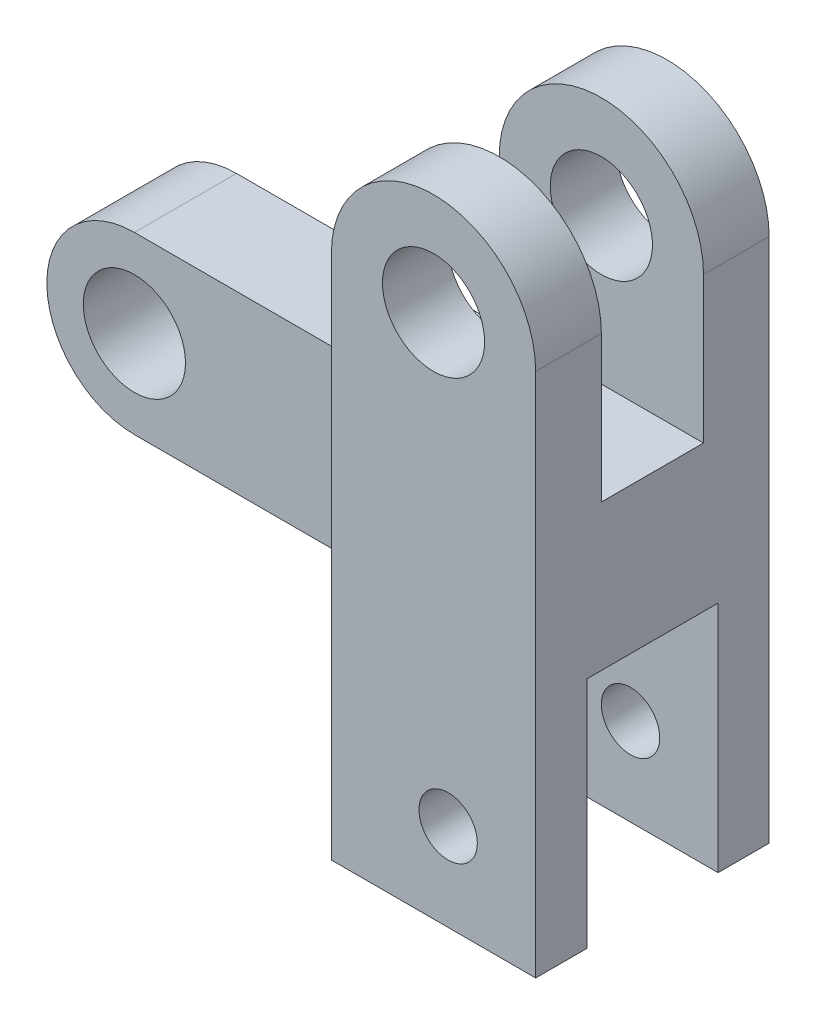
ISO-10303-21;
HEADER;
FILE_DESCRIPTION(('STEP AP214'),'2;1');
FILE_NAME('part.step','',(''),(''),'','','');
FILE_SCHEMA(('AUTOMOTIVE_DESIGN { 1 0 10303 214 1 1 1 1 }'));
ENDSEC;
DATA;
#1=APPLICATION_CONTEXT('core data for automotive mechanical design processes');
#2=APPLICATION_PROTOCOL_DEFINITION('international standard','automotive_design',2000,#1);
#3=PRODUCT_CONTEXT('',#1,'mechanical');
#4=PRODUCT('Part','Part','',(#3));
#5=PRODUCT_RELATED_PRODUCT_CATEGORY('part','',(#4));
#6=PRODUCT_DEFINITION_FORMATION('','',#4);
#7=PRODUCT_DEFINITION_CONTEXT('part definition',#1,'design');
#8=PRODUCT_DEFINITION('design','',#6,#7);
#9=PRODUCT_DEFINITION_SHAPE('','',#8);
#10=(LENGTH_UNIT() NAMED_UNIT(*) SI_UNIT(.MILLI.,.METRE.));
#11=(NAMED_UNIT(*) PLANE_ANGLE_UNIT() SI_UNIT($,.RADIAN.));
#12=(NAMED_UNIT(*) SI_UNIT($,.STERADIAN.) SOLID_ANGLE_UNIT());
#13=UNCERTAINTY_MEASURE_WITH_UNIT(LENGTH_MEASURE(1.E-05),#10,'distance_accuracy_value','');
#14=(GEOMETRIC_REPRESENTATION_CONTEXT(3) GLOBAL_UNCERTAINTY_ASSIGNED_CONTEXT((#13)) GLOBAL_UNIT_ASSIGNED_CONTEXT((#10,
#11,#12)) REPRESENTATION_CONTEXT('',''));
#15=CARTESIAN_POINT('',(0.,0.,0.));
#16=DIRECTION('',(0.,0.,1.));
#17=DIRECTION('',(1.,0.,0.));
#18=AXIS2_PLACEMENT_3D('',#15,#16,#17);
#19=CARTESIAN_POINT('',(0.,2.4,-3.5));
#20=DIRECTION('',(1.,0.,0.));
#21=DIRECTION('',(0.,0.,-1.));
#22=AXIS2_PLACEMENT_3D('',#19,#20,#21);
#23=PLANE('',#22);
#24=DIRECTION('',(0.,-1.,0.));
#25=VECTOR('',#24,1.);
#26=CARTESIAN_POINT('',(0.,0.,2.25));
#27=LINE('',#26,#25);
#28=CARTESIAN_POINT('',(0.,0.,2.25));
#29=VERTEX_POINT('',#28);
#30=CARTESIAN_POINT('',(0.,-8.,2.25));
#31=VERTEX_POINT('',#30);
#32=EDGE_CURVE('E239',#29,#31,#27,.T.);
#33=ORIENTED_EDGE('',*,*,#32,.T.);
#34=DIRECTION('',(0.,0.,-1.));
#35=VECTOR('',#34,1.);
#36=CARTESIAN_POINT('',(0.,-8.,3.5));
#37=LINE('',#36,#35);
#38=CARTESIAN_POINT('',(0.,-8.,4.));
#39=VERTEX_POINT('',#38);
#40=EDGE_CURVE('E278',#39,#31,#37,.T.);
#41=ORIENTED_EDGE('',*,*,#40,.F.);
#42=DIRECTION('',(0.,-1.,0.));
#43=VECTOR('',#42,1.);
#44=CARTESIAN_POINT('',(0.,10.,4.));
#45=LINE('',#44,#43);
#46=CARTESIAN_POINT('',(0.,10.,4.));
#47=VERTEX_POINT('',#46);
#48=EDGE_CURVE('E212',#47,#39,#45,.T.);
#49=ORIENTED_EDGE('',*,*,#48,.F.);
#50=DIRECTION('',(0.,0.,1.));
#51=VECTOR('',#50,1.);
#52=CARTESIAN_POINT('',(0.,10.,1.75));
#53=LINE('',#52,#51);
#54=CARTESIAN_POINT('',(0.,10.,1.75));
#55=VERTEX_POINT('',#54);
#56=EDGE_CURVE('E296',#55,#47,#53,.T.);
#57=ORIENTED_EDGE('',*,*,#56,.F.);
#58=DIRECTION('',(0.,1.,0.));
#59=VECTOR('',#58,1.);
#60=CARTESIAN_POINT('',(0.,0.,1.75));
#61=LINE('',#60,#59);
#62=CARTESIAN_POINT('',(0.,5.,1.75));
#63=VERTEX_POINT('',#62);
#64=EDGE_CURVE('E285',#63,#55,#61,.T.);
#65=ORIENTED_EDGE('',*,*,#64,.F.);
#66=CARTESIAN_POINT('',(0.,0.,1.75));
#67=VERTEX_POINT('',#66);
#68=EDGE_CURVE('E290',#67,#63,#61,.T.);
#69=ORIENTED_EDGE('',*,*,#68,.F.);
#70=DIRECTION('',(0.,0.,1.));
#71=VECTOR('',#70,1.);
#72=CARTESIAN_POINT('',(0.,0.,2.25));
#73=LINE('',#72,#71);
#74=EDGE_CURVE('E221',#67,#29,#73,.T.);
#75=ORIENTED_EDGE('',*,*,#74,.T.);
#76=EDGE_LOOP('',(#33,#41,#49,#57,#65,#69,#75));
#77=FACE_BOUND('',#76,.T.);
#78=ADVANCED_FACE('F45',(#77),#23,.F.);
#79=DIRECTION('',(0.,-1.,0.));
#80=VECTOR('',#79,1.);
#81=CARTESIAN_POINT('',(0.,0.,-2.25));
#82=LINE('',#81,#80);
#83=CARTESIAN_POINT('',(0.,0.,-2.25));
#84=VERTEX_POINT('',#83);
#85=CARTESIAN_POINT('',(0.,-8.,-2.25));
#86=VERTEX_POINT('',#85);
#87=EDGE_CURVE('E228',#84,#86,#82,.T.);
#88=ORIENTED_EDGE('',*,*,#87,.F.);
#89=CARTESIAN_POINT('',(0.,0.,-1.75));
#90=VERTEX_POINT('',#89);
#91=EDGE_CURVE('E216',#84,#90,#73,.T.);
#92=ORIENTED_EDGE('',*,*,#91,.T.);
#93=DIRECTION('',(0.,1.,0.));
#94=VECTOR('',#93,1.);
#95=CARTESIAN_POINT('',(0.,0.,-1.75));
#96=LINE('',#95,#94);
#97=CARTESIAN_POINT('',(0.,5.,-1.75));
#98=VERTEX_POINT('',#97);
#99=EDGE_CURVE('E301',#90,#98,#96,.T.);
#100=ORIENTED_EDGE('',*,*,#99,.T.);
#101=CARTESIAN_POINT('',(0.,10.,-1.75));
#102=VERTEX_POINT('',#101);
#103=EDGE_CURVE('E298',#98,#102,#96,.T.);
#104=ORIENTED_EDGE('',*,*,#103,.T.);
#105=DIRECTION('',(0.,0.,-1.));
#106=VECTOR('',#105,1.);
#107=CARTESIAN_POINT('',(0.,10.,-1.75));
#108=LINE('',#107,#106);
#109=CARTESIAN_POINT('',(0.,10.,-4.));
#110=VERTEX_POINT('',#109);
#111=EDGE_CURVE('E169',#102,#110,#108,.T.);
#112=ORIENTED_EDGE('',*,*,#111,.T.);
#113=DIRECTION('',(0.,1.,0.));
#114=VECTOR('',#113,1.);
#115=CARTESIAN_POINT('',(0.,-8.,-4.));
#116=LINE('',#115,#114);
#117=CARTESIAN_POINT('',(0.,-8.,-4.));
#118=VERTEX_POINT('',#117);
#119=EDGE_CURVE('E187',#118,#110,#116,.T.);
#120=ORIENTED_EDGE('',*,*,#119,.F.);
#121=EDGE_CURVE('E277',#86,#118,#37,.T.);
#122=ORIENTED_EDGE('',*,*,#121,.F.);
#123=EDGE_LOOP('',(#88,#92,#100,#104,#112,#120,#122));
#124=FACE_BOUND('',#123,.T.);
#125=ADVANCED_FACE('F368',(#124),#23,.F.);
#126=CARTESIAN_POINT('',(7.,2.4,-3.5));
#127=DIRECTION('',(-1.,0.,0.));
#128=DIRECTION('',(0.,0.,1.));
#129=AXIS2_PLACEMENT_3D('',#126,#127,#128);
#130=PLANE('',#129);
#131=DIRECTION('',(0.,-1.,0.));
#132=VECTOR('',#131,1.);
#133=CARTESIAN_POINT('',(7.,0.,2.25));
#134=LINE('',#133,#132);
#135=CARTESIAN_POINT('',(7.,0.,2.25));
#136=VERTEX_POINT('',#135);
#137=CARTESIAN_POINT('',(7.,-8.,2.25));
#138=VERTEX_POINT('',#137);
#139=EDGE_CURVE('E237',#136,#138,#134,.T.);
#140=ORIENTED_EDGE('',*,*,#139,.F.);
#141=DIRECTION('',(0.,0.,-1.));
#142=VECTOR('',#141,1.);
#143=CARTESIAN_POINT('',(7.,0.,2.25));
#144=LINE('',#143,#142);
#145=CARTESIAN_POINT('',(7.,0.,-2.25));
#146=VERTEX_POINT('',#145);
#147=EDGE_CURVE('E223',#136,#146,#144,.T.);
#148=ORIENTED_EDGE('',*,*,#147,.T.);
#149=DIRECTION('',(0.,-1.,0.));
#150=VECTOR('',#149,1.);
#151=CARTESIAN_POINT('',(7.,0.,-2.25));
#152=LINE('',#151,#150);
#153=CARTESIAN_POINT('',(7.,-8.,-2.25));
#154=VERTEX_POINT('',#153);
#155=EDGE_CURVE('E235',#146,#154,#152,.T.);
#156=ORIENTED_EDGE('',*,*,#155,.T.);
#157=DIRECTION('',(0.,0.,1.));
#158=VECTOR('',#157,1.);
#159=CARTESIAN_POINT('',(7.,-8.,-3.5));
#160=LINE('',#159,#158);
#161=CARTESIAN_POINT('',(7.,-8.,-4.));
#162=VERTEX_POINT('',#161);
#163=EDGE_CURVE('E177',#162,#154,#160,.T.);
#164=ORIENTED_EDGE('',*,*,#163,.F.);
#165=DIRECTION('',(0.,-1.,0.));
#166=VECTOR('',#165,1.);
#167=CARTESIAN_POINT('',(7.,10.,-4.));
#168=LINE('',#167,#166);
#169=CARTESIAN_POINT('',(7.,10.,-4.));
#170=VERTEX_POINT('',#169);
#171=EDGE_CURVE('E172',#170,#162,#168,.T.);
#172=ORIENTED_EDGE('',*,*,#171,.F.);
#173=DIRECTION('',(0.,0.,-1.));
#174=VECTOR('',#173,1.);
#175=CARTESIAN_POINT('',(7.,10.,-1.75));
#176=LINE('',#175,#174);
#177=CARTESIAN_POINT('',(7.,10.,-1.75));
#178=VERTEX_POINT('',#177);
#179=EDGE_CURVE('E53',#178,#170,#176,.T.);
#180=ORIENTED_EDGE('',*,*,#179,.F.);
#181=DIRECTION('',(0.,-1.,0.));
#182=VECTOR('',#181,1.);
#183=CARTESIAN_POINT('',(7.,0.,-1.75));
#184=LINE('',#183,#182);
#185=CARTESIAN_POINT('',(7.,5.,-1.75));
#186=VERTEX_POINT('',#185);
#187=EDGE_CURVE('E303',#178,#186,#184,.T.);
#188=ORIENTED_EDGE('',*,*,#187,.T.);
#189=DIRECTION('',(0.,0.,-1.));
#190=VECTOR('',#189,1.);
#191=CARTESIAN_POINT('',(7.,5.,1.75));
#192=LINE('',#191,#190);
#193=CARTESIAN_POINT('',(7.,5.,1.75));
#194=VERTEX_POINT('',#193);
#195=EDGE_CURVE('E269',#194,#186,#192,.T.);
#196=ORIENTED_EDGE('',*,*,#195,.F.);
#197=DIRECTION('',(0.,-1.,0.));
#198=VECTOR('',#197,1.);
#199=CARTESIAN_POINT('',(7.,0.,1.75));
#200=LINE('',#199,#198);
#201=CARTESIAN_POINT('',(7.,10.,1.75));
#202=VERTEX_POINT('',#201);
#203=EDGE_CURVE('E292',#202,#194,#200,.T.);
#204=ORIENTED_EDGE('',*,*,#203,.F.);
#205=DIRECTION('',(0.,0.,1.));
#206=VECTOR('',#205,1.);
#207=CARTESIAN_POINT('',(7.,10.,1.75));
#208=LINE('',#207,#206);
#209=CARTESIAN_POINT('',(7.,10.,4.));
#210=VERTEX_POINT('',#209);
#211=EDGE_CURVE('E294',#202,#210,#208,.T.);
#212=ORIENTED_EDGE('',*,*,#211,.T.);
#213=DIRECTION('',(0.,1.,0.));
#214=VECTOR('',#213,1.);
#215=CARTESIAN_POINT('',(7.,-8.,4.));
#216=LINE('',#215,#214);
#217=CARTESIAN_POINT('',(7.,-8.,4.));
#218=VERTEX_POINT('',#217);
#219=EDGE_CURVE('E206',#218,#210,#216,.T.);
#220=ORIENTED_EDGE('',*,*,#219,.F.);
#221=EDGE_CURVE('E275',#138,#218,#160,.T.);
#222=ORIENTED_EDGE('',*,*,#221,.F.);
#223=EDGE_LOOP('',(#140,#148,#156,#164,#172,#180,#188,#196,#204,#212,#220,#222));
#224=FACE_BOUND('',#223,.T.);
#225=ADVANCED_FACE('F174',(#224),#130,.F.);
#226=CARTESIAN_POINT('',(0.,-8.,0.));
#227=DIRECTION('',(0.,-1.,0.));
#228=DIRECTION('',(0.,0.,-1.));
#229=AXIS2_PLACEMENT_3D('',#226,#227,#228);
#230=PLANE('',#229);
#231=ORIENTED_EDGE('',*,*,#40,.T.);
#232=DIRECTION('',(1.,0.,0.));
#233=VECTOR('',#232,1.);
#234=CARTESIAN_POINT('',(0.,-8.,2.25));
#235=LINE('',#234,#233);
#236=EDGE_CURVE('E215',#31,#138,#235,.T.);
#237=ORIENTED_EDGE('',*,*,#236,.T.);
#238=ORIENTED_EDGE('',*,*,#221,.T.);
#239=DIRECTION('',(1.,0.,0.));
#240=VECTOR('',#239,1.);
#241=CARTESIAN_POINT('',(0.,-8.,4.));
#242=LINE('',#241,#240);
#243=EDGE_CURVE('E203',#39,#218,#242,.T.);
#244=ORIENTED_EDGE('',*,*,#243,.F.);
#245=EDGE_LOOP('',(#231,#237,#238,#244));
#246=FACE_BOUND('',#245,.T.);
#247=ADVANCED_FACE('F330',(#246),#230,.T.);
#248=ORIENTED_EDGE('',*,*,#163,.T.);
#249=DIRECTION('',(-1.,0.,0.));
#250=VECTOR('',#249,1.);
#251=CARTESIAN_POINT('',(0.,-8.,-2.25));
#252=LINE('',#251,#250);
#253=EDGE_CURVE('E231',#154,#86,#252,.T.);
#254=ORIENTED_EDGE('',*,*,#253,.T.);
#255=ORIENTED_EDGE('',*,*,#121,.T.);
#256=DIRECTION('',(-1.,0.,0.));
#257=VECTOR('',#256,1.);
#258=CARTESIAN_POINT('',(7.,-8.,-4.));
#259=LINE('',#258,#257);
#260=EDGE_CURVE('E181',#162,#118,#259,.T.);
#261=ORIENTED_EDGE('',*,*,#260,.F.);
#262=EDGE_LOOP('',(#248,#254,#255,#261));
#263=FACE_BOUND('',#262,.T.);
#264=ADVANCED_FACE('F379',(#263),#230,.T.);
#265=CARTESIAN_POINT('',(4.,-5.,-3.5));
#266=DIRECTION('',(0.,0.,1.));
#267=DIRECTION('',(1.,0.,0.));
#268=AXIS2_PLACEMENT_3D('',#265,#266,#267);
#269=CYLINDRICAL_SURFACE('',#268,1.);
#270=CARTESIAN_POINT('',(4.,-5.,2.25));
#271=DIRECTION('',(0.,0.,-1.));
#272=DIRECTION('',(-1.,0.,0.));
#273=AXIS2_PLACEMENT_3D('',#270,#271,#272);
#274=CIRCLE('',#273,1.);
#275=CARTESIAN_POINT('',(3.,-5.,2.25));
#276=VERTEX_POINT('',#275);
#277=EDGE_CURVE('E48',#276,#276,#274,.T.);
#278=ORIENTED_EDGE('',*,*,#277,.T.);
#279=EDGE_LOOP('',(#278));
#280=FACE_BOUND('',#279,.T.);
#281=CARTESIAN_POINT('',(4.,-5.,4.));
#282=DIRECTION('',(0.,0.,1.));
#283=DIRECTION('',(1.,0.,0.));
#284=AXIS2_PLACEMENT_3D('',#281,#282,#283);
#285=CIRCLE('',#284,1.);
#286=CARTESIAN_POINT('',(5.,-5.,4.));
#287=VERTEX_POINT('',#286);
#288=EDGE_CURVE('E200',#287,#287,#285,.T.);
#289=ORIENTED_EDGE('',*,*,#288,.T.);
#290=EDGE_LOOP('',(#289));
#291=FACE_BOUND('',#290,.T.);
#292=ADVANCED_FACE('F313',(#280,#291),#269,.F.);
#293=CARTESIAN_POINT('',(4.,-5.,-2.25));
#294=DIRECTION('',(0.,0.,1.));
#295=DIRECTION('',(1.,0.,0.));
#296=AXIS2_PLACEMENT_3D('',#293,#294,#295);
#297=CIRCLE('',#296,1.);
#298=CARTESIAN_POINT('',(5.,-5.,-2.25));
#299=VERTEX_POINT('',#298);
#300=EDGE_CURVE('E242',#299,#299,#297,.T.);
#301=ORIENTED_EDGE('',*,*,#300,.T.);
#302=EDGE_LOOP('',(#301));
#303=FACE_BOUND('',#302,.T.);
#304=CARTESIAN_POINT('',(4.,-5.,-4.));
#305=DIRECTION('',(0.,0.,-1.));
#306=DIRECTION('',(-1.,0.,0.));
#307=AXIS2_PLACEMENT_3D('',#304,#305,#306);
#308=CIRCLE('',#307,0.999999999999997);
#309=CARTESIAN_POINT('',(3.,-5.,-4.));
#310=VERTEX_POINT('',#309);
#311=EDGE_CURVE('E188',#310,#310,#308,.T.);
#312=ORIENTED_EDGE('',*,*,#311,.T.);
#313=EDGE_LOOP('',(#312));
#314=FACE_BOUND('',#313,.T.);
#315=ADVANCED_FACE('F387',(#303,#314),#269,.F.);
#316=CARTESIAN_POINT('',(3.5,10.,-1.75));
#317=DIRECTION('',(0.,0.,-1.));
#318=DIRECTION('',(-1.,0.,0.));
#319=AXIS2_PLACEMENT_3D('',#316,#317,#318);
#320=CYLINDRICAL_SURFACE('',#319,3.5);
#321=ORIENTED_EDGE('',*,*,#179,.T.);
#322=CARTESIAN_POINT('',(3.5,10.,-4.));
#323=DIRECTION('',(0.,0.,-1.));
#324=DIRECTION('',(-1.,0.,0.));
#325=AXIS2_PLACEMENT_3D('',#322,#323,#324);
#326=CIRCLE('',#325,3.5);
#327=EDGE_CURVE('E165',#110,#170,#326,.T.);
#328=ORIENTED_EDGE('',*,*,#327,.F.);
#329=ORIENTED_EDGE('',*,*,#111,.F.);
#330=CARTESIAN_POINT('',(3.5,10.,-1.75));
#331=DIRECTION('',(0.,0.,-1.));
#332=DIRECTION('',(-1.,0.,0.));
#333=AXIS2_PLACEMENT_3D('',#330,#331,#332);
#334=CIRCLE('',#333,3.5);
#335=EDGE_CURVE('E167',#102,#178,#334,.T.);
#336=ORIENTED_EDGE('',*,*,#335,.T.);
#337=EDGE_LOOP('',(#321,#328,#329,#336));
#338=FACE_BOUND('',#337,.T.);
#339=ADVANCED_FACE('F162',(#338),#320,.T.);
#340=CARTESIAN_POINT('',(0.,0.,-1.75));
#341=DIRECTION('',(0.,0.,-1.));
#342=DIRECTION('',(-1.,0.,0.));
#343=AXIS2_PLACEMENT_3D('',#340,#341,#342);
#344=PLANE('',#343);
#345=CARTESIAN_POINT('',(3.5,10.,-1.75));
#346=DIRECTION('',(0.,0.,-1.));
#347=DIRECTION('',(-1.,0.,0.));
#348=AXIS2_PLACEMENT_3D('',#345,#346,#347);
#349=CIRCLE('',#348,1.75);
#350=CARTESIAN_POINT('',(1.75,10.,-1.75));
#351=VERTEX_POINT('',#350);
#352=EDGE_CURVE('E282',#351,#351,#349,.T.);
#353=ORIENTED_EDGE('',*,*,#352,.T.);
#354=EDGE_LOOP('',(#353));
#355=FACE_BOUND('',#354,.T.);
#356=ORIENTED_EDGE('',*,*,#103,.F.);
#357=DIRECTION('',(1.,0.,0.));
#358=VECTOR('',#357,1.);
#359=CARTESIAN_POINT('',(0.,5.,-1.75));
#360=LINE('',#359,#358);
#361=EDGE_CURVE('E69',#98,#186,#360,.T.);
#362=ORIENTED_EDGE('',*,*,#361,.T.);
#363=ORIENTED_EDGE('',*,*,#187,.F.);
#364=ORIENTED_EDGE('',*,*,#335,.F.);
#365=EDGE_LOOP('',(#356,#362,#363,#364));
#366=FACE_BOUND('',#365,.T.);
#367=ADVANCED_FACE('F369',(#355,#366),#344,.F.);
#368=CARTESIAN_POINT('',(3.5,10.,1.75));
#369=DIRECTION('',(0.,0.,1.));
#370=DIRECTION('',(1.,0.,0.));
#371=AXIS2_PLACEMENT_3D('',#368,#369,#370);
#372=CYLINDRICAL_SURFACE('',#371,3.5);
#373=ORIENTED_EDGE('',*,*,#56,.T.);
#374=CARTESIAN_POINT('',(3.5,10.,4.));
#375=DIRECTION('',(0.,0.,1.));
#376=DIRECTION('',(1.,0.,0.));
#377=AXIS2_PLACEMENT_3D('',#374,#375,#376);
#378=CIRCLE('',#377,3.5);
#379=EDGE_CURVE('E209',#210,#47,#378,.T.);
#380=ORIENTED_EDGE('',*,*,#379,.F.);
#381=ORIENTED_EDGE('',*,*,#211,.F.);
#382=CARTESIAN_POINT('',(3.5,10.,1.75));
#383=DIRECTION('',(0.,0.,-1.));
#384=DIRECTION('',(-1.,0.,0.));
#385=AXIS2_PLACEMENT_3D('',#382,#383,#384);
#386=CIRCLE('',#385,3.5);
#387=EDGE_CURVE('E289',#55,#202,#386,.T.);
#388=ORIENTED_EDGE('',*,*,#387,.F.);
#389=EDGE_LOOP('',(#373,#380,#381,#388));
#390=FACE_BOUND('',#389,.T.);
#391=ADVANCED_FACE('F340',(#390),#372,.T.);
#392=CARTESIAN_POINT('',(0.,0.,1.75));
#393=DIRECTION('',(0.,0.,-1.));
#394=DIRECTION('',(-1.,0.,0.));
#395=AXIS2_PLACEMENT_3D('',#392,#393,#394);
#396=PLANE('',#395);
#397=DIRECTION('',(1.,0.,0.));
#398=VECTOR('',#397,1.);
#399=CARTESIAN_POINT('',(0.,5.,1.75));
#400=LINE('',#399,#398);
#401=EDGE_CURVE('E12',#63,#194,#400,.T.);
#402=ORIENTED_EDGE('',*,*,#401,.F.);
#403=ORIENTED_EDGE('',*,*,#64,.T.);
#404=ORIENTED_EDGE('',*,*,#387,.T.);
#405=ORIENTED_EDGE('',*,*,#203,.T.);
#406=EDGE_LOOP('',(#402,#403,#404,#405));
#407=FACE_BOUND('',#406,.T.);
#408=CARTESIAN_POINT('',(3.5,10.,1.75));
#409=DIRECTION('',(0.,0.,-1.));
#410=DIRECTION('',(-1.,0.,0.));
#411=AXIS2_PLACEMENT_3D('',#408,#409,#410);
#412=CIRCLE('',#411,1.75);
#413=CARTESIAN_POINT('',(1.75,10.,1.75));
#414=VERTEX_POINT('',#413);
#415=EDGE_CURVE('E281',#414,#414,#412,.T.);
#416=ORIENTED_EDGE('',*,*,#415,.F.);
#417=EDGE_LOOP('',(#416));
#418=FACE_BOUND('',#417,.T.);
#419=ADVANCED_FACE('F345',(#407,#418),#396,.T.);
#420=CARTESIAN_POINT('',(3.5,10.,3.5));
#421=DIRECTION('',(0.,0.,-1.));
#422=DIRECTION('',(-1.,0.,0.));
#423=AXIS2_PLACEMENT_3D('',#420,#421,#422);
#424=CYLINDRICAL_SURFACE('',#423,1.75);
#425=ORIENTED_EDGE('',*,*,#415,.T.);
#426=EDGE_LOOP('',(#425));
#427=FACE_BOUND('',#426,.T.);
#428=CARTESIAN_POINT('',(3.5,10.,4.));
#429=DIRECTION('',(0.,0.,1.));
#430=DIRECTION('',(1.,0.,0.));
#431=AXIS2_PLACEMENT_3D('',#428,#429,#430);
#432=CIRCLE('',#431,1.75);
#433=CARTESIAN_POINT('',(5.25,10.,4.));
#434=VERTEX_POINT('',#433);
#435=EDGE_CURVE('E197',#434,#434,#432,.T.);
#436=ORIENTED_EDGE('',*,*,#435,.T.);
#437=EDGE_LOOP('',(#436));
#438=FACE_BOUND('',#437,.T.);
#439=ADVANCED_FACE('F411',(#427,#438),#424,.F.);
#440=ORIENTED_EDGE('',*,*,#352,.F.);
#441=EDGE_LOOP('',(#440));
#442=FACE_BOUND('',#441,.T.);
#443=CARTESIAN_POINT('',(3.5,10.,-4.));
#444=DIRECTION('',(0.,0.,-1.));
#445=DIRECTION('',(-1.,0.,0.));
#446=AXIS2_PLACEMENT_3D('',#443,#444,#445);
#447=CIRCLE('',#446,1.75);
#448=CARTESIAN_POINT('',(1.75,10.,-4.));
#449=VERTEX_POINT('',#448);
#450=EDGE_CURVE('E191',#449,#449,#447,.T.);
#451=ORIENTED_EDGE('',*,*,#450,.T.);
#452=EDGE_LOOP('',(#451));
#453=FACE_BOUND('',#452,.T.);
#454=ADVANCED_FACE('F413',(#442,#453),#424,.F.);
#455=CARTESIAN_POINT('',(0.,-1.,1.75));
#456=DIRECTION('',(0.,1.,0.));
#457=DIRECTION('',(-1.,0.,0.));
#458=AXIS2_PLACEMENT_3D('',#455,#456,#457);
#459=PLANE('',#458);
#460=DIRECTION('',(1.,0.,0.));
#461=VECTOR('',#460,1.);
#462=CARTESIAN_POINT('',(0.,-1.,-1.75));
#463=LINE('',#462,#461);
#464=CARTESIAN_POINT('',(-9.,-1.,-1.75));
#465=VERTEX_POINT('',#464);
#466=CARTESIAN_POINT('',(0.,-1.,-1.75));
#467=VERTEX_POINT('',#466);
#468=EDGE_CURVE('E263',#465,#467,#463,.T.);
#469=ORIENTED_EDGE('',*,*,#468,.T.);
#470=DIRECTION('',(0.,0.,1.));
#471=VECTOR('',#470,1.);
#472=CARTESIAN_POINT('',(0.,-1.,-3.5));
#473=LINE('',#472,#471);
#474=CARTESIAN_POINT('',(0.,-1.,1.75));
#475=VERTEX_POINT('',#474);
#476=EDGE_CURVE('E61',#467,#475,#473,.T.);
#477=ORIENTED_EDGE('',*,*,#476,.T.);
#478=DIRECTION('',(1.,0.,0.));
#479=VECTOR('',#478,1.);
#480=CARTESIAN_POINT('',(0.,-1.,1.75));
#481=LINE('',#480,#479);
#482=CARTESIAN_POINT('',(-9.,-1.,1.75));
#483=VERTEX_POINT('',#482);
#484=EDGE_CURVE('E250',#483,#475,#481,.T.);
#485=ORIENTED_EDGE('',*,*,#484,.F.);
#486=DIRECTION('',(0.,0.,-1.));
#487=VECTOR('',#486,1.);
#488=CARTESIAN_POINT('',(-9.,-1.,1.75));
#489=LINE('',#488,#487);
#490=EDGE_CURVE('E272',#483,#465,#489,.T.);
#491=ORIENTED_EDGE('',*,*,#490,.T.);
#492=EDGE_LOOP('',(#469,#477,#485,#491));
#493=FACE_BOUND('',#492,.T.);
#494=ADVANCED_FACE('F355',(#493),#459,.F.);
#495=CARTESIAN_POINT('',(0.,0.,1.75));
#496=DIRECTION('',(0.,0.,1.));
#497=DIRECTION('',(1.,0.,0.));
#498=AXIS2_PLACEMENT_3D('',#495,#496,#497);
#499=PLANE('',#498);
#500=CARTESIAN_POINT('',(-9.,2.,1.75));
#501=DIRECTION('',(0.,0.,1.));
#502=DIRECTION('',(1.,0.,0.));
#503=AXIS2_PLACEMENT_3D('',#500,#501,#502);
#504=CIRCLE('',#503,1.75);
#505=CARTESIAN_POINT('',(-7.25,2.,1.75));
#506=VERTEX_POINT('',#505);
#507=EDGE_CURVE('E243',#506,#506,#504,.T.);
#508=ORIENTED_EDGE('',*,*,#507,.F.);
#509=EDGE_LOOP('',(#508));
#510=FACE_BOUND('',#509,.T.);
#511=EDGE_CURVE('E286',#475,#67,#61,.T.);
#512=ORIENTED_EDGE('',*,*,#511,.T.);
#513=ORIENTED_EDGE('',*,*,#68,.T.);
#514=DIRECTION('',(1.,0.,0.));
#515=VECTOR('',#514,1.);
#516=CARTESIAN_POINT('',(0.,5.,1.75));
#517=LINE('',#516,#515);
#518=CARTESIAN_POINT('',(-9.,5.,1.75));
#519=VERTEX_POINT('',#518);
#520=EDGE_CURVE('E253',#519,#63,#517,.T.);
#521=ORIENTED_EDGE('',*,*,#520,.F.);
#522=CARTESIAN_POINT('',(-9.,2.,1.75));
#523=DIRECTION('',(0.,0.,1.));
#524=DIRECTION('',(1.,0.,0.));
#525=AXIS2_PLACEMENT_3D('',#522,#523,#524);
#526=CIRCLE('',#525,3.);
#527=EDGE_CURVE('E246',#483,#519,#526,.F.);
#528=ORIENTED_EDGE('',*,*,#527,.F.);
#529=ORIENTED_EDGE('',*,*,#484,.T.);
#530=EDGE_LOOP('',(#512,#513,#521,#528,#529));
#531=FACE_BOUND('',#530,.T.);
#532=ADVANCED_FACE('F349',(#510,#531),#499,.T.);
#533=CARTESIAN_POINT('',(0.,0.,-1.75));
#534=DIRECTION('',(0.,0.,1.));
#535=DIRECTION('',(1.,0.,0.));
#536=AXIS2_PLACEMENT_3D('',#533,#534,#535);
#537=PLANE('',#536);
#538=CARTESIAN_POINT('',(-9.,2.,-1.75));
#539=DIRECTION('',(0.,0.,1.));
#540=DIRECTION('',(1.,0.,0.));
#541=AXIS2_PLACEMENT_3D('',#538,#539,#540);
#542=CIRCLE('',#541,1.75);
#543=CARTESIAN_POINT('',(-7.25,2.,-1.75));
#544=VERTEX_POINT('',#543);
#545=EDGE_CURVE('E257',#544,#544,#542,.T.);
#546=ORIENTED_EDGE('',*,*,#545,.T.);
#547=EDGE_LOOP('',(#546));
#548=FACE_BOUND('',#547,.T.);
#549=CARTESIAN_POINT('',(-9.,5.,-1.75));
#550=VERTEX_POINT('',#549);
#551=EDGE_CURVE('E247',#550,#98,#360,.T.);
#552=ORIENTED_EDGE('',*,*,#551,.T.);
#553=ORIENTED_EDGE('',*,*,#99,.F.);
#554=EDGE_CURVE('E299',#467,#90,#96,.T.);
#555=ORIENTED_EDGE('',*,*,#554,.F.);
#556=ORIENTED_EDGE('',*,*,#468,.F.);
#557=CARTESIAN_POINT('',(-9.,2.,-1.75));
#558=DIRECTION('',(0.,0.,1.));
#559=DIRECTION('',(1.,0.,0.));
#560=AXIS2_PLACEMENT_3D('',#557,#558,#559);
#561=CIRCLE('',#560,3.);
#562=EDGE_CURVE('E260',#465,#550,#561,.F.);
#563=ORIENTED_EDGE('',*,*,#562,.T.);
#564=EDGE_LOOP('',(#552,#553,#555,#556,#563));
#565=FACE_BOUND('',#564,.T.);
#566=ADVANCED_FACE('F359',(#548,#565),#537,.F.);
#567=CARTESIAN_POINT('',(-9.,2.,1.75));
#568=DIRECTION('',(0.,0.,-1.));
#569=DIRECTION('',(-1.,0.,0.));
#570=AXIS2_PLACEMENT_3D('',#567,#568,#569);
#571=CYLINDRICAL_SURFACE('',#570,3.);
#572=ORIENTED_EDGE('',*,*,#562,.F.);
#573=ORIENTED_EDGE('',*,*,#490,.F.);
#574=ORIENTED_EDGE('',*,*,#527,.T.);
#575=DIRECTION('',(0.,0.,-1.));
#576=VECTOR('',#575,1.);
#577=CARTESIAN_POINT('',(-9.,5.,1.75));
#578=LINE('',#577,#576);
#579=EDGE_CURVE('E256',#519,#550,#578,.T.);
#580=ORIENTED_EDGE('',*,*,#579,.T.);
#581=EDGE_LOOP('',(#572,#573,#574,#580));
#582=FACE_BOUND('',#581,.T.);
#583=ADVANCED_FACE('F363',(#582),#571,.T.);
#584=CARTESIAN_POINT('',(-9.,2.,1.75));
#585=DIRECTION('',(0.,0.,-1.));
#586=DIRECTION('',(-1.,0.,0.));
#587=AXIS2_PLACEMENT_3D('',#584,#585,#586);
#588=CYLINDRICAL_SURFACE('',#587,1.75);
#589=ORIENTED_EDGE('',*,*,#507,.T.);
#590=EDGE_LOOP('',(#589));
#591=FACE_BOUND('',#590,.T.);
#592=ORIENTED_EDGE('',*,*,#545,.F.);
#593=EDGE_LOOP('',(#592));
#594=FACE_BOUND('',#593,.T.);
#595=ADVANCED_FACE('F445',(#591,#594),#588,.F.);
#596=CARTESIAN_POINT('',(0.,5.,1.75));
#597=DIRECTION('',(0.,1.,0.));
#598=DIRECTION('',(0.,0.,1.));
#599=AXIS2_PLACEMENT_3D('',#596,#597,#598);
#600=PLANE('',#599);
#601=ORIENTED_EDGE('',*,*,#551,.F.);
#602=ORIENTED_EDGE('',*,*,#579,.F.);
#603=ORIENTED_EDGE('',*,*,#520,.T.);
#604=ORIENTED_EDGE('',*,*,#401,.T.);
#605=ORIENTED_EDGE('',*,*,#195,.T.);
#606=ORIENTED_EDGE('',*,*,#361,.F.);
#607=EDGE_LOOP('',(#601,#602,#603,#604,#605,#606));
#608=FACE_BOUND('',#607,.T.);
#609=ADVANCED_FACE('F365',(#608),#600,.T.);
#610=CARTESIAN_POINT('',(0.,0.,2.25));
#611=DIRECTION('',(1.,0.,0.));
#612=DIRECTION('',(0.,0.,-1.));
#613=AXIS2_PLACEMENT_3D('',#610,#611,#612);
#614=PLANE('',#613);
#615=ORIENTED_EDGE('',*,*,#476,.F.);
#616=ORIENTED_EDGE('',*,*,#554,.T.);
#617=EDGE_CURVE('E220',#90,#67,#73,.T.);
#618=ORIENTED_EDGE('',*,*,#617,.T.);
#619=ORIENTED_EDGE('',*,*,#511,.F.);
#620=EDGE_LOOP('',(#615,#616,#618,#619));
#621=FACE_BOUND('',#620,.T.);
#622=ADVANCED_FACE('F320',(#621),#614,.T.);
#623=CARTESIAN_POINT('',(0.,0.,2.25));
#624=DIRECTION('',(0.,0.,-1.));
#625=DIRECTION('',(-1.,0.,0.));
#626=AXIS2_PLACEMENT_3D('',#623,#624,#625);
#627=PLANE('',#626);
#628=ORIENTED_EDGE('',*,*,#277,.F.);
#629=EDGE_LOOP('',(#628));
#630=FACE_BOUND('',#629,.T.);
#631=ORIENTED_EDGE('',*,*,#236,.F.);
#632=ORIENTED_EDGE('',*,*,#32,.F.);
#633=DIRECTION('',(1.,0.,0.));
#634=VECTOR('',#633,1.);
#635=CARTESIAN_POINT('',(0.,0.,2.25));
#636=LINE('',#635,#634);
#637=EDGE_CURVE('E219',#29,#136,#636,.T.);
#638=ORIENTED_EDGE('',*,*,#637,.T.);
#639=ORIENTED_EDGE('',*,*,#139,.T.);
#640=EDGE_LOOP('',(#631,#632,#638,#639));
#641=FACE_BOUND('',#640,.T.);
#642=ADVANCED_FACE('F316',(#630,#641),#627,.T.);
#643=CARTESIAN_POINT('',(0.,0.,-2.25));
#644=DIRECTION('',(0.,0.,1.));
#645=DIRECTION('',(1.,0.,0.));
#646=AXIS2_PLACEMENT_3D('',#643,#644,#645);
#647=PLANE('',#646);
#648=ORIENTED_EDGE('',*,*,#300,.F.);
#649=EDGE_LOOP('',(#648));
#650=FACE_BOUND('',#649,.T.);
#651=ORIENTED_EDGE('',*,*,#253,.F.);
#652=ORIENTED_EDGE('',*,*,#155,.F.);
#653=DIRECTION('',(-1.,0.,0.));
#654=VECTOR('',#653,1.);
#655=CARTESIAN_POINT('',(0.,0.,-2.25));
#656=LINE('',#655,#654);
#657=EDGE_CURVE('E226',#146,#84,#656,.T.);
#658=ORIENTED_EDGE('',*,*,#657,.T.);
#659=ORIENTED_EDGE('',*,*,#87,.T.);
#660=EDGE_LOOP('',(#651,#652,#658,#659));
#661=FACE_BOUND('',#660,.T.);
#662=ADVANCED_FACE('F319',(#650,#661),#647,.T.);
#663=CARTESIAN_POINT('',(0.,0.,0.));
#664=DIRECTION('',(0.,-1.,0.));
#665=DIRECTION('',(0.,0.,-1.));
#666=AXIS2_PLACEMENT_3D('',#663,#664,#665);
#667=PLANE('',#666);
#668=ORIENTED_EDGE('',*,*,#91,.F.);
#669=ORIENTED_EDGE('',*,*,#657,.F.);
#670=ORIENTED_EDGE('',*,*,#147,.F.);
#671=ORIENTED_EDGE('',*,*,#637,.F.);
#672=ORIENTED_EDGE('',*,*,#74,.F.);
#673=ORIENTED_EDGE('',*,*,#617,.F.);
#674=EDGE_LOOP('',(#668,#669,#670,#671,#672,#673));
#675=FACE_BOUND('',#674,.T.);
#676=ADVANCED_FACE('F375',(#675),#667,.T.);
#677=CARTESIAN_POINT('',(3.5,10.,4.));
#678=DIRECTION('',(0.,0.,1.));
#679=DIRECTION('',(1.,0.,0.));
#680=AXIS2_PLACEMENT_3D('',#677,#678,#679);
#681=PLANE('',#680);
#682=ORIENTED_EDGE('',*,*,#288,.F.);
#683=EDGE_LOOP('',(#682));
#684=FACE_BOUND('',#683,.T.);
#685=ORIENTED_EDGE('',*,*,#243,.T.);
#686=ORIENTED_EDGE('',*,*,#219,.T.);
#687=ORIENTED_EDGE('',*,*,#379,.T.);
#688=ORIENTED_EDGE('',*,*,#48,.T.);
#689=EDGE_LOOP('',(#685,#686,#687,#688));
#690=FACE_BOUND('',#689,.T.);
#691=ORIENTED_EDGE('',*,*,#435,.F.);
#692=EDGE_LOOP('',(#691));
#693=FACE_BOUND('',#692,.T.);
#694=ADVANCED_FACE('F333',(#684,#690,#693),#681,.T.);
#695=CARTESIAN_POINT('',(3.5,10.,-4.));
#696=DIRECTION('',(0.,0.,-1.));
#697=DIRECTION('',(-1.,0.,0.));
#698=AXIS2_PLACEMENT_3D('',#695,#696,#697);
#699=PLANE('',#698);
#700=ORIENTED_EDGE('',*,*,#311,.F.);
#701=EDGE_LOOP('',(#700));
#702=FACE_BOUND('',#701,.T.);
#703=ORIENTED_EDGE('',*,*,#327,.T.);
#704=ORIENTED_EDGE('',*,*,#171,.T.);
#705=ORIENTED_EDGE('',*,*,#260,.T.);
#706=ORIENTED_EDGE('',*,*,#119,.T.);
#707=EDGE_LOOP('',(#703,#704,#705,#706));
#708=FACE_BOUND('',#707,.T.);
#709=ORIENTED_EDGE('',*,*,#450,.F.);
#710=EDGE_LOOP('',(#709));
#711=FACE_BOUND('',#710,.T.);
#712=ADVANCED_FACE('F184',(#702,#708,#711),#699,.T.);
#713=CLOSED_SHELL('',(#78,#125,#225,#247,#264,#292,#315,#339,#367,#391,#419,#439,#454,#494,#532,
#566,#583,#595,#609,#622,#642,#662,#676,#694,#712));
#714=MANIFOLD_SOLID_BREP('B2',#713);
#715=ADVANCED_BREP_SHAPE_REPRESENTATION('',(#18,#714),#14);
#716=SHAPE_DEFINITION_REPRESENTATION(#9,#715);
ENDSEC;
END-ISO-10303-21;
